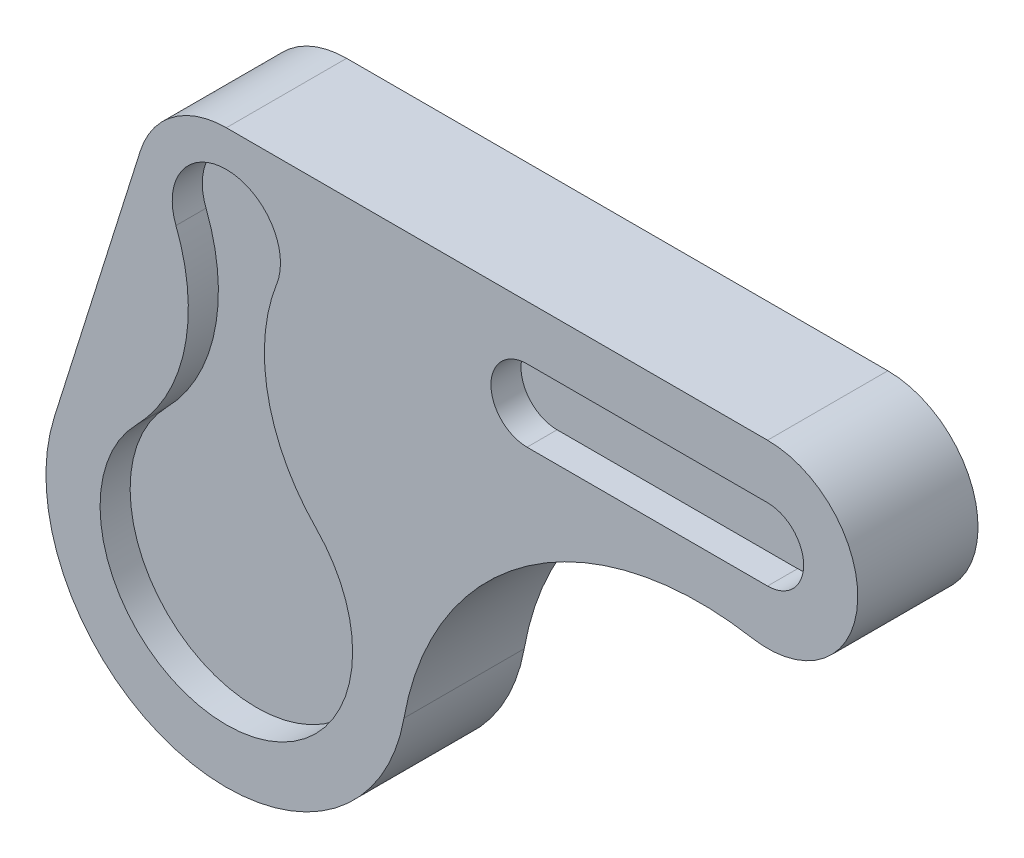
ISO-10303-21;
HEADER;
FILE_DESCRIPTION(('STEP AP214'),'2;1');
FILE_NAME('part.step','',(''),(''),'','','');
FILE_SCHEMA(('AUTOMOTIVE_DESIGN { 1 0 10303 214 1 1 1 1 }'));
ENDSEC;
DATA;
#1=APPLICATION_CONTEXT('core data for automotive mechanical design processes');
#2=APPLICATION_PROTOCOL_DEFINITION('international standard','automotive_design',2000,#1);
#3=PRODUCT_CONTEXT('',#1,'mechanical');
#4=PRODUCT('Part','Part','',(#3));
#5=PRODUCT_RELATED_PRODUCT_CATEGORY('part','',(#4));
#6=PRODUCT_DEFINITION_FORMATION('','',#4);
#7=PRODUCT_DEFINITION_CONTEXT('part definition',#1,'design');
#8=PRODUCT_DEFINITION('design','',#6,#7);
#9=PRODUCT_DEFINITION_SHAPE('','',#8);
#10=(LENGTH_UNIT() NAMED_UNIT(*) SI_UNIT(.MILLI.,.METRE.));
#11=(NAMED_UNIT(*) PLANE_ANGLE_UNIT() SI_UNIT($,.RADIAN.));
#12=(NAMED_UNIT(*) SI_UNIT($,.STERADIAN.) SOLID_ANGLE_UNIT());
#13=UNCERTAINTY_MEASURE_WITH_UNIT(LENGTH_MEASURE(1.E-05),#10,'distance_accuracy_value','');
#14=(GEOMETRIC_REPRESENTATION_CONTEXT(3) GLOBAL_UNCERTAINTY_ASSIGNED_CONTEXT((#13)) GLOBAL_UNIT_ASSIGNED_CONTEXT((#10,
#11,#12)) REPRESENTATION_CONTEXT('',''));
#15=CARTESIAN_POINT('',(0.,0.,0.));
#16=DIRECTION('',(0.,0.,1.));
#17=DIRECTION('',(1.,0.,0.));
#18=AXIS2_PLACEMENT_3D('',#15,#16,#17);
#19=CARTESIAN_POINT('',(90.,50.,10.));
#20=DIRECTION('',(0.,0.,-1.));
#21=DIRECTION('',(-1.,0.,0.));
#22=AXIS2_PLACEMENT_3D('',#19,#20,#21);
#23=CYLINDRICAL_SURFACE('',#22,6.00000000000001);
#24=DIRECTION('',(0.,0.,-1.));
#25=VECTOR('',#24,1.);
#26=CARTESIAN_POINT('',(90.,44.,10.));
#27=LINE('',#26,#25);
#28=CARTESIAN_POINT('',(90.,44.,-5.));
#29=VERTEX_POINT('',#28);
#30=CARTESIAN_POINT('',(90.,44.,-10.));
#31=VERTEX_POINT('',#30);
#32=EDGE_CURVE('E232',#29,#31,#27,.T.);
#33=ORIENTED_EDGE('',*,*,#32,.F.);
#34=CARTESIAN_POINT('',(90.,50.,-5.));
#35=DIRECTION('',(0.,0.,1.));
#36=DIRECTION('',(1.,0.,0.));
#37=AXIS2_PLACEMENT_3D('',#34,#35,#36);
#38=CIRCLE('',#37,6.00000000000001);
#39=CARTESIAN_POINT('',(90.,56.,-5.));
#40=VERTEX_POINT('',#39);
#41=EDGE_CURVE('E205',#29,#40,#38,.T.);
#42=ORIENTED_EDGE('',*,*,#41,.T.);
#43=DIRECTION('',(0.,0.,-1.));
#44=VECTOR('',#43,1.);
#45=CARTESIAN_POINT('',(90.,56.,10.));
#46=LINE('',#45,#44);
#47=CARTESIAN_POINT('',(90.,56.,-10.));
#48=VERTEX_POINT('',#47);
#49=EDGE_CURVE('E239',#40,#48,#46,.T.);
#50=ORIENTED_EDGE('',*,*,#49,.T.);
#51=CARTESIAN_POINT('',(90.,50.,-10.));
#52=DIRECTION('',(0.,0.,1.));
#53=DIRECTION('',(1.,0.,0.));
#54=AXIS2_PLACEMENT_3D('',#51,#52,#53);
#55=CIRCLE('',#54,6.00000000000001);
#56=EDGE_CURVE('E359',#31,#48,#55,.T.);
#57=ORIENTED_EDGE('',*,*,#56,.F.);
#58=EDGE_LOOP('',(#33,#42,#50,#57));
#59=FACE_BOUND('',#58,.T.);
#60=ADVANCED_FACE('F45',(#59),#23,.F.);
#61=CARTESIAN_POINT('',(90.,56.,10.));
#62=DIRECTION('',(0.,-1.,0.));
#63=DIRECTION('',(0.,0.,-1.));
#64=AXIS2_PLACEMENT_3D('',#61,#62,#63);
#65=PLANE('',#64);
#66=ORIENTED_EDGE('',*,*,#49,.F.);
#67=DIRECTION('',(-1.,0.,0.));
#68=VECTOR('',#67,1.);
#69=CARTESIAN_POINT('',(90.,56.,-5.));
#70=LINE('',#69,#68);
#71=CARTESIAN_POINT('',(50.,56.,-5.));
#72=VERTEX_POINT('',#71);
#73=EDGE_CURVE('E220',#40,#72,#70,.T.);
#74=ORIENTED_EDGE('',*,*,#73,.T.);
#75=DIRECTION('',(0.,0.,-1.));
#76=VECTOR('',#75,1.);
#77=CARTESIAN_POINT('',(50.,56.,10.));
#78=LINE('',#77,#76);
#79=CARTESIAN_POINT('',(50.,56.,-10.));
#80=VERTEX_POINT('',#79);
#81=EDGE_CURVE('E218',#72,#80,#78,.T.);
#82=ORIENTED_EDGE('',*,*,#81,.T.);
#83=DIRECTION('',(-1.,0.,0.));
#84=VECTOR('',#83,1.);
#85=CARTESIAN_POINT('',(90.,56.,-10.));
#86=LINE('',#85,#84);
#87=EDGE_CURVE('E376',#48,#80,#86,.T.);
#88=ORIENTED_EDGE('',*,*,#87,.F.);
#89=EDGE_LOOP('',(#66,#74,#82,#88));
#90=FACE_BOUND('',#89,.T.);
#91=ADVANCED_FACE('F390',(#90),#65,.T.);
#92=CARTESIAN_POINT('',(50.,50.,10.));
#93=DIRECTION('',(0.,0.,-1.));
#94=DIRECTION('',(-1.,0.,0.));
#95=AXIS2_PLACEMENT_3D('',#92,#93,#94);
#96=CYLINDRICAL_SURFACE('',#95,6.00000000000001);
#97=ORIENTED_EDGE('',*,*,#81,.F.);
#98=CARTESIAN_POINT('',(50.,50.,-5.));
#99=DIRECTION('',(0.,0.,1.));
#100=DIRECTION('',(1.,0.,0.));
#101=AXIS2_PLACEMENT_3D('',#98,#99,#100);
#102=CIRCLE('',#101,6.00000000000001);
#103=CARTESIAN_POINT('',(50.,44.,-5.));
#104=VERTEX_POINT('',#103);
#105=EDGE_CURVE('E202',#72,#104,#102,.T.);
#106=ORIENTED_EDGE('',*,*,#105,.T.);
#107=DIRECTION('',(0.,0.,-1.));
#108=VECTOR('',#107,1.);
#109=CARTESIAN_POINT('',(50.,44.,10.));
#110=LINE('',#109,#108);
#111=CARTESIAN_POINT('',(50.,44.,-10.));
#112=VERTEX_POINT('',#111);
#113=EDGE_CURVE('E216',#104,#112,#110,.T.);
#114=ORIENTED_EDGE('',*,*,#113,.T.);
#115=CARTESIAN_POINT('',(50.,50.,-10.));
#116=DIRECTION('',(0.,0.,1.));
#117=DIRECTION('',(1.,0.,0.));
#118=AXIS2_PLACEMENT_3D('',#115,#116,#117);
#119=CIRCLE('',#118,6.00000000000001);
#120=EDGE_CURVE('E380',#80,#112,#119,.T.);
#121=ORIENTED_EDGE('',*,*,#120,.F.);
#122=EDGE_LOOP('',(#97,#106,#114,#121));
#123=FACE_BOUND('',#122,.T.);
#124=ADVANCED_FACE('F214',(#123),#96,.F.);
#125=CARTESIAN_POINT('',(90.,44.,10.));
#126=DIRECTION('',(0.,1.,0.));
#127=DIRECTION('',(-1.,0.,0.));
#128=AXIS2_PLACEMENT_3D('',#125,#126,#127);
#129=PLANE('',#128);
#130=ORIENTED_EDGE('',*,*,#113,.F.);
#131=DIRECTION('',(-1.,0.,0.));
#132=VECTOR('',#131,1.);
#133=CARTESIAN_POINT('',(90.,44.,-5.));
#134=LINE('',#133,#132);
#135=EDGE_CURVE('E199',#29,#104,#134,.T.);
#136=ORIENTED_EDGE('',*,*,#135,.F.);
#137=ORIENTED_EDGE('',*,*,#32,.T.);
#138=DIRECTION('',(1.,0.,0.));
#139=VECTOR('',#138,1.);
#140=CARTESIAN_POINT('',(90.,44.,-10.));
#141=LINE('',#140,#139);
#142=EDGE_CURVE('E224',#112,#31,#141,.T.);
#143=ORIENTED_EDGE('',*,*,#142,.F.);
#144=EDGE_LOOP('',(#130,#136,#137,#143));
#145=FACE_BOUND('',#144,.T.);
#146=ADVANCED_FACE('F222',(#145),#129,.T.);
#147=CARTESIAN_POINT('',(-18.1614977355944,17.9,5.));
#148=DIRECTION('',(0.,0.,-1.));
#149=DIRECTION('',(-1.,0.,0.));
#150=AXIS2_PLACEMENT_3D('',#147,#148,#149);
#151=PLANE('',#150);
#152=CARTESIAN_POINT('',(-36.3229954711888,35.8,5.));
#153=DIRECTION('',(0.,0.,-1.));
#154=DIRECTION('',(-1.,0.,0.));
#155=AXIS2_PLACEMENT_3D('',#152,#153,#154);
#156=CIRCLE('',#155,30.);
#157=CARTESIAN_POINT('',(-8.38222972412048,46.7230769230769,5.));
#158=VERTEX_POINT('',#157);
#159=CARTESIAN_POINT('',(-14.9565275469601,14.7411764705882,5.));
#160=VERTEX_POINT('',#159);
#161=EDGE_CURVE('E306',#158,#160,#156,.T.);
#162=ORIENTED_EDGE('',*,*,#161,.T.);
#163=CARTESIAN_POINT('',(0.,0.,5.));
#164=DIRECTION('',(0.,0.,1.));
#165=DIRECTION('',(1.,0.,0.));
#166=AXIS2_PLACEMENT_3D('',#163,#164,#165);
#167=CIRCLE('',#166,21.);
#168=CARTESIAN_POINT('',(14.9565275469601,14.7411764705882,5.));
#169=VERTEX_POINT('',#168);
#170=EDGE_CURVE('E310',#160,#169,#167,.T.);
#171=ORIENTED_EDGE('',*,*,#170,.T.);
#172=CARTESIAN_POINT('',(36.3229954711888,35.8,5.));
#173=DIRECTION('',(0.,0.,1.));
#174=DIRECTION('',(1.,0.,0.));
#175=AXIS2_PLACEMENT_3D('',#172,#173,#174);
#176=CIRCLE('',#175,30.);
#177=CARTESIAN_POINT('',(8.38222972412047,46.7230769230769,5.));
#178=VERTEX_POINT('',#177);
#179=EDGE_CURVE('E55',#178,#169,#176,.T.);
#180=ORIENTED_EDGE('',*,*,#179,.F.);
#181=CARTESIAN_POINT('',(0.,50.,5.));
#182=DIRECTION('',(0.,0.,1.));
#183=DIRECTION('',(1.,0.,0.));
#184=AXIS2_PLACEMENT_3D('',#181,#182,#183);
#185=CIRCLE('',#184,8.99999999999998);
#186=EDGE_CURVE('E11',#178,#158,#185,.T.);
#187=ORIENTED_EDGE('',*,*,#186,.T.);
#188=EDGE_LOOP('',(#162,#171,#180,#187));
#189=FACE_BOUND('',#188,.T.);
#190=ADVANCED_FACE('F506',(#189),#151,.F.);
#191=CARTESIAN_POINT('',(36.3229954711888,35.8,10.));
#192=DIRECTION('',(0.,0.,-1.));
#193=DIRECTION('',(-1.,0.,0.));
#194=AXIS2_PLACEMENT_3D('',#191,#192,#193);
#195=CYLINDRICAL_SURFACE('',#194,30.);
#196=ORIENTED_EDGE('',*,*,#179,.T.);
#197=DIRECTION('',(0.,0.,-1.));
#198=VECTOR('',#197,1.);
#199=CARTESIAN_POINT('',(14.9565275469601,14.7411764705882,10.));
#200=LINE('',#199,#198);
#201=CARTESIAN_POINT('',(14.9565275469601,14.7411764705882,10.));
#202=VERTEX_POINT('',#201);
#203=EDGE_CURVE('E435',#202,#169,#200,.T.);
#204=ORIENTED_EDGE('',*,*,#203,.F.);
#205=CARTESIAN_POINT('',(36.3229954711888,35.8,10.));
#206=DIRECTION('',(0.,0.,-1.));
#207=DIRECTION('',(1.,0.,0.));
#208=AXIS2_PLACEMENT_3D('',#205,#206,#207);
#209=CIRCLE('',#208,30.);
#210=CARTESIAN_POINT('',(8.38222972412047,46.7230769230769,10.));
#211=VERTEX_POINT('',#210);
#212=EDGE_CURVE('E414',#202,#211,#209,.T.);
#213=ORIENTED_EDGE('',*,*,#212,.T.);
#214=DIRECTION('',(0.,0.,-1.));
#215=VECTOR('',#214,1.);
#216=CARTESIAN_POINT('',(8.38222972412047,46.7230769230769,10.));
#217=LINE('',#216,#215);
#218=EDGE_CURVE('E355',#211,#178,#217,.T.);
#219=ORIENTED_EDGE('',*,*,#218,.T.);
#220=EDGE_LOOP('',(#196,#204,#213,#219));
#221=FACE_BOUND('',#220,.T.);
#222=ADVANCED_FACE('F509',(#221),#195,.T.);
#223=CARTESIAN_POINT('',(0.,50.,10.));
#224=DIRECTION('',(0.,0.,-1.));
#225=DIRECTION('',(-1.,0.,0.));
#226=AXIS2_PLACEMENT_3D('',#223,#224,#225);
#227=CYLINDRICAL_SURFACE('',#226,8.99999999999998);
#228=ORIENTED_EDGE('',*,*,#186,.F.);
#229=ORIENTED_EDGE('',*,*,#218,.F.);
#230=CARTESIAN_POINT('',(0.,50.,10.));
#231=DIRECTION('',(0.,0.,1.));
#232=DIRECTION('',(1.,0.,0.));
#233=AXIS2_PLACEMENT_3D('',#230,#231,#232);
#234=CIRCLE('',#233,8.99999999999998);
#235=CARTESIAN_POINT('',(-8.38222972412048,46.7230769230769,10.));
#236=VERTEX_POINT('',#235);
#237=EDGE_CURVE('E417',#211,#236,#234,.T.);
#238=ORIENTED_EDGE('',*,*,#237,.T.);
#239=DIRECTION('',(0.,0.,-1.));
#240=VECTOR('',#239,1.);
#241=CARTESIAN_POINT('',(-8.38222972412048,46.7230769230769,10.));
#242=LINE('',#241,#240);
#243=EDGE_CURVE('E344',#236,#158,#242,.T.);
#244=ORIENTED_EDGE('',*,*,#243,.T.);
#245=EDGE_LOOP('',(#228,#229,#238,#244));
#246=FACE_BOUND('',#245,.T.);
#247=ADVANCED_FACE('F502',(#246),#227,.F.);
#248=CARTESIAN_POINT('',(-36.3229954711888,35.8,10.));
#249=DIRECTION('',(0.,0.,-1.));
#250=DIRECTION('',(-1.,0.,0.));
#251=AXIS2_PLACEMENT_3D('',#248,#249,#250);
#252=CYLINDRICAL_SURFACE('',#251,30.);
#253=ORIENTED_EDGE('',*,*,#161,.F.);
#254=ORIENTED_EDGE('',*,*,#243,.F.);
#255=CARTESIAN_POINT('',(-36.3229954711888,35.8,10.));
#256=DIRECTION('',(0.,0.,-1.));
#257=DIRECTION('',(-1.,0.,0.));
#258=AXIS2_PLACEMENT_3D('',#255,#256,#257);
#259=CIRCLE('',#258,30.);
#260=CARTESIAN_POINT('',(-14.9565275469601,14.7411764705882,10.));
#261=VERTEX_POINT('',#260);
#262=EDGE_CURVE('E421',#236,#261,#259,.T.);
#263=ORIENTED_EDGE('',*,*,#262,.T.);
#264=DIRECTION('',(0.,0.,-1.));
#265=VECTOR('',#264,1.);
#266=CARTESIAN_POINT('',(-14.9565275469601,14.7411764705882,10.));
#267=LINE('',#266,#265);
#268=EDGE_CURVE('E345',#261,#160,#267,.T.);
#269=ORIENTED_EDGE('',*,*,#268,.T.);
#270=EDGE_LOOP('',(#253,#254,#263,#269));
#271=FACE_BOUND('',#270,.T.);
#272=ADVANCED_FACE('F504',(#271),#252,.T.);
#273=CARTESIAN_POINT('',(0.,0.,10.));
#274=DIRECTION('',(0.,0.,-1.));
#275=DIRECTION('',(-1.,0.,0.));
#276=AXIS2_PLACEMENT_3D('',#273,#274,#275);
#277=CYLINDRICAL_SURFACE('',#276,21.);
#278=ORIENTED_EDGE('',*,*,#170,.F.);
#279=ORIENTED_EDGE('',*,*,#268,.F.);
#280=CARTESIAN_POINT('',(0.,0.,10.));
#281=DIRECTION('',(0.,0.,1.));
#282=DIRECTION('',(1.,0.,0.));
#283=AXIS2_PLACEMENT_3D('',#280,#281,#282);
#284=CIRCLE('',#283,21.);
#285=EDGE_CURVE('E425',#261,#202,#284,.T.);
#286=ORIENTED_EDGE('',*,*,#285,.T.);
#287=ORIENTED_EDGE('',*,*,#203,.T.);
#288=EDGE_LOOP('',(#278,#279,#286,#287));
#289=FACE_BOUND('',#288,.T.);
#290=ADVANCED_FACE('F460',(#289),#277,.F.);
#291=CARTESIAN_POINT('',(0.,50.,10.));
#292=DIRECTION('',(0.,0.,1.));
#293=DIRECTION('',(1.,0.,0.));
#294=AXIS2_PLACEMENT_3D('',#291,#292,#293);
#295=PLANE('',#294);
#296=CARTESIAN_POINT('',(0.,50.,10.));
#297=DIRECTION('',(0.,0.,1.));
#298=DIRECTION('',(1.,0.,0.));
#299=AXIS2_PLACEMENT_3D('',#296,#297,#298);
#300=CIRCLE('',#299,15.);
#301=CARTESIAN_POINT('',(0.,65.,10.));
#302=VERTEX_POINT('',#301);
#303=CARTESIAN_POINT('',(-14.3090880212542,54.5,10.));
#304=VERTEX_POINT('',#303);
#305=EDGE_CURVE('E244',#302,#304,#300,.T.);
#306=ORIENTED_EDGE('',*,*,#305,.T.);
#307=DIRECTION('',(-0.3,-0.953939201416946,0.));
#308=VECTOR('',#307,1.);
#309=CARTESIAN_POINT('',(-14.3090880212542,54.5,10.));
#310=LINE('',#309,#308);
#311=CARTESIAN_POINT('',(-28.6181760425084,8.99999999999999,10.));
#312=VERTEX_POINT('',#311);
#313=EDGE_CURVE('E248',#304,#312,#310,.T.);
#314=ORIENTED_EDGE('',*,*,#313,.T.);
#315=CARTESIAN_POINT('',(0.,0.,10.));
#316=DIRECTION('',(0.,0.,1.));
#317=DIRECTION('',(1.,0.,0.));
#318=AXIS2_PLACEMENT_3D('',#315,#316,#317);
#319=CIRCLE('',#318,30.);
#320=CARTESIAN_POINT('',(29.5356455942332,-5.25791206961977,10.));
#321=VERTEX_POINT('',#320);
#322=EDGE_CURVE('E252',#312,#321,#319,.T.);
#323=ORIENTED_EDGE('',*,*,#322,.T.);
#324=CARTESIAN_POINT('',(78.7617215846219,-14.0210988523194,10.));
#325=DIRECTION('',(0.,0.,-1.));
#326=DIRECTION('',(1.,0.,0.));
#327=AXIS2_PLACEMENT_3D('',#324,#325,#326);
#328=CIRCLE('',#327,50.);
#329=CARTESIAN_POINT('',(87.4065511349127,35.2259002648494,10.));
#330=VERTEX_POINT('',#329);
#331=EDGE_CURVE('E255',#321,#330,#328,.T.);
#332=ORIENTED_EDGE('',*,*,#331,.T.);
#333=CARTESIAN_POINT('',(90.,50.,10.));
#334=DIRECTION('',(0.,0.,1.));
#335=DIRECTION('',(-1.,0.,0.));
#336=AXIS2_PLACEMENT_3D('',#333,#334,#335);
#337=CIRCLE('',#336,15.);
#338=CARTESIAN_POINT('',(90.,65.,10.));
#339=VERTEX_POINT('',#338);
#340=EDGE_CURVE('E258',#330,#339,#337,.T.);
#341=ORIENTED_EDGE('',*,*,#340,.T.);
#342=DIRECTION('',(-1.,0.,0.));
#343=VECTOR('',#342,1.);
#344=CARTESIAN_POINT('',(0.,65.,10.));
#345=LINE('',#344,#343);
#346=EDGE_CURVE('E261',#339,#302,#345,.T.);
#347=ORIENTED_EDGE('',*,*,#346,.T.);
#348=EDGE_LOOP('',(#306,#314,#323,#332,#341,#347));
#349=FACE_BOUND('',#348,.T.);
#350=DIRECTION('',(-1.,0.,0.));
#351=VECTOR('',#350,1.);
#352=CARTESIAN_POINT('',(90.,56.,10.));
#353=LINE('',#352,#351);
#354=CARTESIAN_POINT('',(90.,56.,10.));
#355=VERTEX_POINT('',#354);
#356=CARTESIAN_POINT('',(50.,56.,10.));
#357=VERTEX_POINT('',#356);
#358=EDGE_CURVE('E363',#355,#357,#353,.T.);
#359=ORIENTED_EDGE('',*,*,#358,.F.);
#360=CARTESIAN_POINT('',(90.,50.,10.));
#361=DIRECTION('',(0.,0.,1.));
#362=DIRECTION('',(1.,0.,0.));
#363=AXIS2_PLACEMENT_3D('',#360,#361,#362);
#364=CIRCLE('',#363,6.00000000000001);
#365=CARTESIAN_POINT('',(90.,44.,10.));
#366=VERTEX_POINT('',#365);
#367=EDGE_CURVE('E360',#366,#355,#364,.T.);
#368=ORIENTED_EDGE('',*,*,#367,.F.);
#369=DIRECTION('',(1.,0.,0.));
#370=VECTOR('',#369,1.);
#371=CARTESIAN_POINT('',(90.,44.,10.));
#372=LINE('',#371,#370);
#373=CARTESIAN_POINT('',(50.,44.,10.));
#374=VERTEX_POINT('',#373);
#375=EDGE_CURVE('E370',#374,#366,#372,.T.);
#376=ORIENTED_EDGE('',*,*,#375,.F.);
#377=CARTESIAN_POINT('',(50.,50.,10.));
#378=DIRECTION('',(0.,0.,1.));
#379=DIRECTION('',(1.,0.,0.));
#380=AXIS2_PLACEMENT_3D('',#377,#378,#379);
#381=CIRCLE('',#380,6.00000000000001);
#382=EDGE_CURVE('E366',#357,#374,#381,.T.);
#383=ORIENTED_EDGE('',*,*,#382,.F.);
#384=EDGE_LOOP('',(#359,#368,#376,#383));
#385=FACE_BOUND('',#384,.T.);
#386=ORIENTED_EDGE('',*,*,#237,.F.);
#387=ORIENTED_EDGE('',*,*,#212,.F.);
#388=ORIENTED_EDGE('',*,*,#285,.F.);
#389=ORIENTED_EDGE('',*,*,#262,.F.);
#390=EDGE_LOOP('',(#386,#387,#388,#389));
#391=FACE_BOUND('',#390,.T.);
#392=ADVANCED_FACE('F451',(#349,#385,#391),#295,.T.);
#393=CARTESIAN_POINT('',(0.,50.,-10.));
#394=DIRECTION('',(0.,0.,1.));
#395=DIRECTION('',(1.,0.,0.));
#396=AXIS2_PLACEMENT_3D('',#393,#394,#395);
#397=PLANE('',#396);
#398=ORIENTED_EDGE('',*,*,#56,.T.);
#399=ORIENTED_EDGE('',*,*,#87,.T.);
#400=ORIENTED_EDGE('',*,*,#120,.T.);
#401=ORIENTED_EDGE('',*,*,#142,.T.);
#402=EDGE_LOOP('',(#398,#399,#400,#401));
#403=FACE_BOUND('',#402,.T.);
#404=CARTESIAN_POINT('',(0.,50.,-10.));
#405=DIRECTION('',(0.,0.,1.));
#406=DIRECTION('',(1.,0.,0.));
#407=AXIS2_PLACEMENT_3D('',#404,#405,#406);
#408=CIRCLE('',#407,15.);
#409=CARTESIAN_POINT('',(0.,65.,-10.));
#410=VERTEX_POINT('',#409);
#411=CARTESIAN_POINT('',(-14.3090880212542,54.5,-10.));
#412=VERTEX_POINT('',#411);
#413=EDGE_CURVE('E243',#410,#412,#408,.T.);
#414=ORIENTED_EDGE('',*,*,#413,.F.);
#415=DIRECTION('',(-1.,0.,0.));
#416=VECTOR('',#415,1.);
#417=CARTESIAN_POINT('',(0.,65.,-10.));
#418=LINE('',#417,#416);
#419=CARTESIAN_POINT('',(90.,65.,-10.));
#420=VERTEX_POINT('',#419);
#421=EDGE_CURVE('E249',#420,#410,#418,.T.);
#422=ORIENTED_EDGE('',*,*,#421,.F.);
#423=CARTESIAN_POINT('',(90.,50.,-10.));
#424=DIRECTION('',(0.,0.,1.));
#425=DIRECTION('',(-1.,0.,0.));
#426=AXIS2_PLACEMENT_3D('',#423,#424,#425);
#427=CIRCLE('',#426,15.);
#428=CARTESIAN_POINT('',(87.4065511349127,35.2259002648494,-10.));
#429=VERTEX_POINT('',#428);
#430=EDGE_CURVE('E277',#429,#420,#427,.T.);
#431=ORIENTED_EDGE('',*,*,#430,.F.);
#432=CARTESIAN_POINT('',(78.7617215846219,-14.0210988523194,-10.));
#433=DIRECTION('',(0.,0.,-1.));
#434=DIRECTION('',(1.,0.,0.));
#435=AXIS2_PLACEMENT_3D('',#432,#433,#434);
#436=CIRCLE('',#435,50.);
#437=CARTESIAN_POINT('',(29.5356455942332,-5.25791206961977,-10.));
#438=VERTEX_POINT('',#437);
#439=EDGE_CURVE('E274',#438,#429,#436,.T.);
#440=ORIENTED_EDGE('',*,*,#439,.F.);
#441=CARTESIAN_POINT('',(0.,0.,-10.));
#442=DIRECTION('',(0.,0.,1.));
#443=DIRECTION('',(1.,0.,0.));
#444=AXIS2_PLACEMENT_3D('',#441,#442,#443);
#445=CIRCLE('',#444,30.);
#446=CARTESIAN_POINT('',(-28.6181760425084,8.99999999999999,-10.));
#447=VERTEX_POINT('',#446);
#448=EDGE_CURVE('E271',#447,#438,#445,.T.);
#449=ORIENTED_EDGE('',*,*,#448,.F.);
#450=DIRECTION('',(-0.3,-0.953939201416946,0.));
#451=VECTOR('',#450,1.);
#452=CARTESIAN_POINT('',(-14.3090880212542,54.5,-10.));
#453=LINE('',#452,#451);
#454=EDGE_CURVE('E268',#412,#447,#453,.T.);
#455=ORIENTED_EDGE('',*,*,#454,.F.);
#456=EDGE_LOOP('',(#414,#422,#431,#440,#449,#455));
#457=FACE_BOUND('',#456,.T.);
#458=CARTESIAN_POINT('',(36.3229954711888,35.8,-10.));
#459=DIRECTION('',(0.,0.,-1.));
#460=DIRECTION('',(1.,0.,0.));
#461=AXIS2_PLACEMENT_3D('',#458,#459,#460);
#462=CIRCLE('',#461,30.);
#463=CARTESIAN_POINT('',(14.9565275469601,14.7411764705882,-10.));
#464=VERTEX_POINT('',#463);
#465=CARTESIAN_POINT('',(8.38222972412047,46.7230769230769,-10.));
#466=VERTEX_POINT('',#465);
#467=EDGE_CURVE('E395',#464,#466,#462,.T.);
#468=ORIENTED_EDGE('',*,*,#467,.T.);
#469=CARTESIAN_POINT('',(0.,50.,-10.));
#470=DIRECTION('',(0.,0.,1.));
#471=DIRECTION('',(1.,0.,0.));
#472=AXIS2_PLACEMENT_3D('',#469,#470,#471);
#473=CIRCLE('',#472,8.99999999999998);
#474=CARTESIAN_POINT('',(-8.38222972412048,46.7230769230769,-10.));
#475=VERTEX_POINT('',#474);
#476=EDGE_CURVE('E400',#466,#475,#473,.T.);
#477=ORIENTED_EDGE('',*,*,#476,.T.);
#478=CARTESIAN_POINT('',(-36.3229954711888,35.8,-10.));
#479=DIRECTION('',(0.,0.,-1.));
#480=DIRECTION('',(-1.,0.,0.));
#481=AXIS2_PLACEMENT_3D('',#478,#479,#480);
#482=CIRCLE('',#481,30.);
#483=CARTESIAN_POINT('',(-14.9565275469601,14.7411764705882,-10.));
#484=VERTEX_POINT('',#483);
#485=EDGE_CURVE('E341',#475,#484,#482,.T.);
#486=ORIENTED_EDGE('',*,*,#485,.T.);
#487=CARTESIAN_POINT('',(0.,0.,-10.));
#488=DIRECTION('',(0.,0.,1.));
#489=DIRECTION('',(1.,0.,0.));
#490=AXIS2_PLACEMENT_3D('',#487,#488,#489);
#491=CIRCLE('',#490,21.);
#492=EDGE_CURVE('E418',#484,#464,#491,.T.);
#493=ORIENTED_EDGE('',*,*,#492,.T.);
#494=EDGE_LOOP('',(#468,#477,#486,#493));
#495=FACE_BOUND('',#494,.T.);
#496=ADVANCED_FACE('F384',(#403,#457,#495),#397,.F.);
#497=CARTESIAN_POINT('',(0.,50.,10.));
#498=DIRECTION('',(0.,0.,-1.));
#499=DIRECTION('',(-1.,0.,0.));
#500=AXIS2_PLACEMENT_3D('',#497,#498,#499);
#501=CYLINDRICAL_SURFACE('',#500,15.);
#502=ORIENTED_EDGE('',*,*,#413,.T.);
#503=DIRECTION('',(0.,0.,-1.));
#504=VECTOR('',#503,1.);
#505=CARTESIAN_POINT('',(-14.3090880212542,54.5,10.));
#506=LINE('',#505,#504);
#507=EDGE_CURVE('E301',#304,#412,#506,.T.);
#508=ORIENTED_EDGE('',*,*,#507,.F.);
#509=ORIENTED_EDGE('',*,*,#305,.F.);
#510=DIRECTION('',(0.,0.,-1.));
#511=VECTOR('',#510,1.);
#512=CARTESIAN_POINT('',(0.,65.,10.));
#513=LINE('',#512,#511);
#514=EDGE_CURVE('E264',#302,#410,#513,.T.);
#515=ORIENTED_EDGE('',*,*,#514,.T.);
#516=EDGE_LOOP('',(#502,#508,#509,#515));
#517=FACE_BOUND('',#516,.T.);
#518=ADVANCED_FACE('F450',(#517),#501,.T.);
#519=CARTESIAN_POINT('',(-14.3090880212542,54.5,10.));
#520=DIRECTION('',(0.953939201416946,-0.3,0.));
#521=DIRECTION('',(0.3,0.953939201416946,0.));
#522=AXIS2_PLACEMENT_3D('',#519,#520,#521);
#523=PLANE('',#522);
#524=ORIENTED_EDGE('',*,*,#454,.T.);
#525=DIRECTION('',(0.,0.,-1.));
#526=VECTOR('',#525,1.);
#527=CARTESIAN_POINT('',(-28.6181760425084,8.99999999999999,10.));
#528=LINE('',#527,#526);
#529=EDGE_CURVE('E297',#312,#447,#528,.T.);
#530=ORIENTED_EDGE('',*,*,#529,.F.);
#531=ORIENTED_EDGE('',*,*,#313,.F.);
#532=ORIENTED_EDGE('',*,*,#507,.T.);
#533=EDGE_LOOP('',(#524,#530,#531,#532));
#534=FACE_BOUND('',#533,.T.);
#535=ADVANCED_FACE('F457',(#534),#523,.F.);
#536=CARTESIAN_POINT('',(0.,0.,10.));
#537=DIRECTION('',(0.,0.,-1.));
#538=DIRECTION('',(-1.,0.,0.));
#539=AXIS2_PLACEMENT_3D('',#536,#537,#538);
#540=CYLINDRICAL_SURFACE('',#539,30.);
#541=ORIENTED_EDGE('',*,*,#448,.T.);
#542=DIRECTION('',(0.,0.,-1.));
#543=VECTOR('',#542,1.);
#544=CARTESIAN_POINT('',(29.5356455942332,-5.25791206961977,10.));
#545=LINE('',#544,#543);
#546=EDGE_CURVE('E293',#321,#438,#545,.T.);
#547=ORIENTED_EDGE('',*,*,#546,.F.);
#548=ORIENTED_EDGE('',*,*,#322,.F.);
#549=ORIENTED_EDGE('',*,*,#529,.T.);
#550=EDGE_LOOP('',(#541,#547,#548,#549));
#551=FACE_BOUND('',#550,.T.);
#552=ADVANCED_FACE('F641',(#551),#540,.T.);
#553=CARTESIAN_POINT('',(78.7617215846219,-14.0210988523194,10.));
#554=DIRECTION('',(0.,0.,-1.));
#555=DIRECTION('',(-1.,0.,0.));
#556=AXIS2_PLACEMENT_3D('',#553,#554,#555);
#557=CYLINDRICAL_SURFACE('',#556,50.);
#558=ORIENTED_EDGE('',*,*,#439,.T.);
#559=DIRECTION('',(0.,0.,-1.));
#560=VECTOR('',#559,1.);
#561=CARTESIAN_POINT('',(87.4065511349127,35.2259002648494,10.));
#562=LINE('',#561,#560);
#563=EDGE_CURVE('E289',#330,#429,#562,.T.);
#564=ORIENTED_EDGE('',*,*,#563,.F.);
#565=ORIENTED_EDGE('',*,*,#331,.F.);
#566=ORIENTED_EDGE('',*,*,#546,.T.);
#567=EDGE_LOOP('',(#558,#564,#565,#566));
#568=FACE_BOUND('',#567,.T.);
#569=ADVANCED_FACE('F631',(#568),#557,.F.);
#570=CARTESIAN_POINT('',(90.,50.,10.));
#571=DIRECTION('',(0.,0.,-1.));
#572=DIRECTION('',(-1.,0.,0.));
#573=AXIS2_PLACEMENT_3D('',#570,#571,#572);
#574=CYLINDRICAL_SURFACE('',#573,15.);
#575=ORIENTED_EDGE('',*,*,#430,.T.);
#576=DIRECTION('',(0.,0.,-1.));
#577=VECTOR('',#576,1.);
#578=CARTESIAN_POINT('',(90.,65.,10.));
#579=LINE('',#578,#577);
#580=EDGE_CURVE('E285',#339,#420,#579,.T.);
#581=ORIENTED_EDGE('',*,*,#580,.F.);
#582=ORIENTED_EDGE('',*,*,#340,.F.);
#583=ORIENTED_EDGE('',*,*,#563,.T.);
#584=EDGE_LOOP('',(#575,#581,#582,#583));
#585=FACE_BOUND('',#584,.T.);
#586=ADVANCED_FACE('F480',(#585),#574,.T.);
#587=CARTESIAN_POINT('',(0.,65.,10.));
#588=DIRECTION('',(0.,-1.,0.));
#589=DIRECTION('',(0.,0.,-1.));
#590=AXIS2_PLACEMENT_3D('',#587,#588,#589);
#591=PLANE('',#590);
#592=ORIENTED_EDGE('',*,*,#421,.T.);
#593=ORIENTED_EDGE('',*,*,#514,.F.);
#594=ORIENTED_EDGE('',*,*,#346,.F.);
#595=ORIENTED_EDGE('',*,*,#580,.T.);
#596=EDGE_LOOP('',(#592,#593,#594,#595));
#597=FACE_BOUND('',#596,.T.);
#598=ADVANCED_FACE('F473',(#597),#591,.F.);
#599=CARTESIAN_POINT('',(90.,50.,5.));
#600=DIRECTION('',(0.,0.,1.));
#601=DIRECTION('',(1.,0.,0.));
#602=AXIS2_PLACEMENT_3D('',#599,#600,#601);
#603=CIRCLE('',#602,6.00000000000001);
#604=CARTESIAN_POINT('',(90.,44.,5.));
#605=VERTEX_POINT('',#604);
#606=CARTESIAN_POINT('',(90.,56.,5.));
#607=VERTEX_POINT('',#606);
#608=EDGE_CURVE('E210',#605,#607,#603,.T.);
#609=ORIENTED_EDGE('',*,*,#608,.F.);
#610=EDGE_CURVE('E228',#366,#605,#27,.T.);
#611=ORIENTED_EDGE('',*,*,#610,.F.);
#612=ORIENTED_EDGE('',*,*,#367,.T.);
#613=EDGE_CURVE('E240',#355,#607,#46,.T.);
#614=ORIENTED_EDGE('',*,*,#613,.T.);
#615=EDGE_LOOP('',(#609,#611,#612,#614));
#616=FACE_BOUND('',#615,.T.);
#617=ADVANCED_FACE('F466',(#616),#23,.F.);
#618=DIRECTION('',(-1.,0.,0.));
#619=VECTOR('',#618,1.);
#620=CARTESIAN_POINT('',(90.,56.,5.));
#621=LINE('',#620,#619);
#622=CARTESIAN_POINT('',(50.,56.,5.));
#623=VERTEX_POINT('',#622);
#624=EDGE_CURVE('E63',#607,#623,#621,.T.);
#625=ORIENTED_EDGE('',*,*,#624,.F.);
#626=ORIENTED_EDGE('',*,*,#613,.F.);
#627=ORIENTED_EDGE('',*,*,#358,.T.);
#628=EDGE_CURVE('E236',#357,#623,#78,.T.);
#629=ORIENTED_EDGE('',*,*,#628,.T.);
#630=EDGE_LOOP('',(#625,#626,#627,#629));
#631=FACE_BOUND('',#630,.T.);
#632=ADVANCED_FACE('F471',(#631),#65,.T.);
#633=CARTESIAN_POINT('',(50.,50.,5.));
#634=DIRECTION('',(0.,0.,1.));
#635=DIRECTION('',(1.,0.,0.));
#636=AXIS2_PLACEMENT_3D('',#633,#634,#635);
#637=CIRCLE('',#636,6.00000000000001);
#638=CARTESIAN_POINT('',(50.,44.,5.));
#639=VERTEX_POINT('',#638);
#640=EDGE_CURVE('E71',#623,#639,#637,.T.);
#641=ORIENTED_EDGE('',*,*,#640,.F.);
#642=ORIENTED_EDGE('',*,*,#628,.F.);
#643=ORIENTED_EDGE('',*,*,#382,.T.);
#644=EDGE_CURVE('E227',#374,#639,#110,.T.);
#645=ORIENTED_EDGE('',*,*,#644,.T.);
#646=EDGE_LOOP('',(#641,#642,#643,#645));
#647=FACE_BOUND('',#646,.T.);
#648=ADVANCED_FACE('F479',(#647),#96,.F.);
#649=DIRECTION('',(-1.,0.,0.));
#650=VECTOR('',#649,1.);
#651=CARTESIAN_POINT('',(90.,44.,5.));
#652=LINE('',#651,#650);
#653=EDGE_CURVE('E404',#605,#639,#652,.T.);
#654=ORIENTED_EDGE('',*,*,#653,.T.);
#655=ORIENTED_EDGE('',*,*,#644,.F.);
#656=ORIENTED_EDGE('',*,*,#375,.T.);
#657=ORIENTED_EDGE('',*,*,#610,.T.);
#658=EDGE_LOOP('',(#654,#655,#656,#657));
#659=FACE_BOUND('',#658,.T.);
#660=ADVANCED_FACE('F489',(#659),#129,.T.);
#661=CARTESIAN_POINT('',(14.9565275469601,14.7411764705882,-5.));
#662=VERTEX_POINT('',#661);
#663=EDGE_CURVE('E427',#662,#464,#200,.T.);
#664=ORIENTED_EDGE('',*,*,#663,.F.);
#665=CARTESIAN_POINT('',(36.3229954711888,35.8,-5.));
#666=DIRECTION('',(0.,0.,1.));
#667=DIRECTION('',(1.,0.,0.));
#668=AXIS2_PLACEMENT_3D('',#665,#666,#667);
#669=CIRCLE('',#668,30.);
#670=CARTESIAN_POINT('',(8.38222972412047,46.7230769230769,-5.));
#671=VERTEX_POINT('',#670);
#672=EDGE_CURVE('E323',#671,#662,#669,.T.);
#673=ORIENTED_EDGE('',*,*,#672,.F.);
#674=EDGE_CURVE('E336',#671,#466,#217,.T.);
#675=ORIENTED_EDGE('',*,*,#674,.T.);
#676=ORIENTED_EDGE('',*,*,#467,.F.);
#677=EDGE_LOOP('',(#664,#673,#675,#676));
#678=FACE_BOUND('',#677,.T.);
#679=ADVANCED_FACE('F447',(#678),#195,.T.);
#680=ORIENTED_EDGE('',*,*,#674,.F.);
#681=CARTESIAN_POINT('',(0.,50.,-5.));
#682=DIRECTION('',(0.,0.,1.));
#683=DIRECTION('',(1.,0.,0.));
#684=AXIS2_PLACEMENT_3D('',#681,#682,#683);
#685=CIRCLE('',#684,8.99999999999998);
#686=CARTESIAN_POINT('',(-8.38222972412048,46.7230769230769,-5.));
#687=VERTEX_POINT('',#686);
#688=EDGE_CURVE('E49',#671,#687,#685,.T.);
#689=ORIENTED_EDGE('',*,*,#688,.T.);
#690=EDGE_CURVE('E334',#687,#475,#242,.T.);
#691=ORIENTED_EDGE('',*,*,#690,.T.);
#692=ORIENTED_EDGE('',*,*,#476,.F.);
#693=EDGE_LOOP('',(#680,#689,#691,#692));
#694=FACE_BOUND('',#693,.T.);
#695=ADVANCED_FACE('F332',(#694),#227,.F.);
#696=ORIENTED_EDGE('',*,*,#690,.F.);
#697=CARTESIAN_POINT('',(-36.3229954711888,35.8,-5.));
#698=DIRECTION('',(0.,0.,-1.));
#699=DIRECTION('',(-1.,0.,0.));
#700=AXIS2_PLACEMENT_3D('',#697,#698,#699);
#701=CIRCLE('',#700,30.);
#702=CARTESIAN_POINT('',(-14.9565275469601,14.7411764705882,-5.));
#703=VERTEX_POINT('',#702);
#704=EDGE_CURVE('E305',#687,#703,#701,.T.);
#705=ORIENTED_EDGE('',*,*,#704,.T.);
#706=EDGE_CURVE('E351',#703,#484,#267,.T.);
#707=ORIENTED_EDGE('',*,*,#706,.T.);
#708=ORIENTED_EDGE('',*,*,#485,.F.);
#709=EDGE_LOOP('',(#696,#705,#707,#708));
#710=FACE_BOUND('',#709,.T.);
#711=ADVANCED_FACE('F338',(#710),#252,.T.);
#712=ORIENTED_EDGE('',*,*,#706,.F.);
#713=CARTESIAN_POINT('',(0.,0.,-5.));
#714=DIRECTION('',(0.,0.,1.));
#715=DIRECTION('',(1.,0.,0.));
#716=AXIS2_PLACEMENT_3D('',#713,#714,#715);
#717=CIRCLE('',#716,21.);
#718=EDGE_CURVE('E320',#703,#662,#717,.T.);
#719=ORIENTED_EDGE('',*,*,#718,.T.);
#720=ORIENTED_EDGE('',*,*,#663,.T.);
#721=ORIENTED_EDGE('',*,*,#492,.F.);
#722=EDGE_LOOP('',(#712,#719,#720,#721));
#723=FACE_BOUND('',#722,.T.);
#724=ADVANCED_FACE('F445',(#723),#277,.F.);
#725=CARTESIAN_POINT('',(-18.1614977355944,17.9,-5.));
#726=DIRECTION('',(0.,0.,-1.));
#727=DIRECTION('',(-1.,0.,0.));
#728=AXIS2_PLACEMENT_3D('',#725,#726,#727);
#729=PLANE('',#728);
#730=ORIENTED_EDGE('',*,*,#704,.F.);
#731=ORIENTED_EDGE('',*,*,#688,.F.);
#732=ORIENTED_EDGE('',*,*,#672,.T.);
#733=ORIENTED_EDGE('',*,*,#718,.F.);
#734=EDGE_LOOP('',(#730,#731,#732,#733));
#735=FACE_BOUND('',#734,.T.);
#736=ADVANCED_FACE('F47',(#735),#729,.T.);
#737=CARTESIAN_POINT('',(90.,50.,-5.));
#738=DIRECTION('',(0.,0.,1.));
#739=DIRECTION('',(1.,0.,0.));
#740=AXIS2_PLACEMENT_3D('',#737,#738,#739);
#741=PLANE('',#740);
#742=ORIENTED_EDGE('',*,*,#41,.F.);
#743=ORIENTED_EDGE('',*,*,#135,.T.);
#744=ORIENTED_EDGE('',*,*,#105,.F.);
#745=ORIENTED_EDGE('',*,*,#73,.F.);
#746=EDGE_LOOP('',(#742,#743,#744,#745));
#747=FACE_BOUND('',#746,.T.);
#748=ADVANCED_FACE('F201',(#747),#741,.F.);
#749=CARTESIAN_POINT('',(90.,50.,5.));
#750=DIRECTION('',(0.,0.,1.));
#751=DIRECTION('',(1.,0.,0.));
#752=AXIS2_PLACEMENT_3D('',#749,#750,#751);
#753=PLANE('',#752);
#754=ORIENTED_EDGE('',*,*,#608,.T.);
#755=ORIENTED_EDGE('',*,*,#624,.T.);
#756=ORIENTED_EDGE('',*,*,#640,.T.);
#757=ORIENTED_EDGE('',*,*,#653,.F.);
#758=EDGE_LOOP('',(#754,#755,#756,#757));
#759=FACE_BOUND('',#758,.T.);
#760=ADVANCED_FACE('F487',(#759),#753,.T.);
#761=CLOSED_SHELL('',(#60,#91,#124,#146,#190,#222,#247,#272,#290,#392,#496,#518,#535,#552,#569,
#586,#598,#617,#632,#648,#660,#679,#695,#711,#724,#736,#748,#760));
#762=MANIFOLD_SOLID_BREP('B2',#761);
#763=ADVANCED_BREP_SHAPE_REPRESENTATION('',(#18,#762),#14);
#764=SHAPE_DEFINITION_REPRESENTATION(#9,#763);
ENDSEC;
END-ISO-10303-21;
